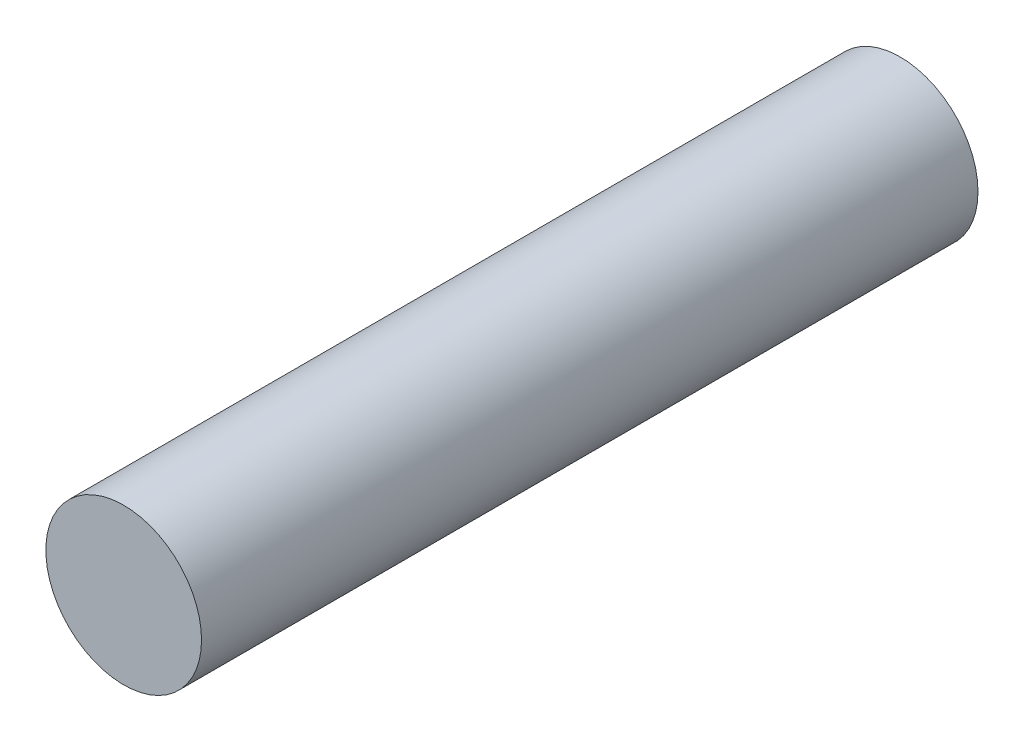
ISO-10303-21;
HEADER;
FILE_DESCRIPTION(('STEP AP214'),'2;1');
FILE_NAME('part.step','',(''),(''),'','','');
FILE_SCHEMA(('AUTOMOTIVE_DESIGN { 1 0 10303 214 1 1 1 1 }'));
ENDSEC;
DATA;
#1=APPLICATION_CONTEXT('core data for automotive mechanical design processes');
#2=APPLICATION_PROTOCOL_DEFINITION('international standard','automotive_design',2000,#1);
#3=PRODUCT_CONTEXT('',#1,'mechanical');
#4=PRODUCT('Part','Part','',(#3));
#5=PRODUCT_RELATED_PRODUCT_CATEGORY('part','',(#4));
#6=PRODUCT_DEFINITION_FORMATION('','',#4);
#7=PRODUCT_DEFINITION_CONTEXT('part definition',#1,'design');
#8=PRODUCT_DEFINITION('design','',#6,#7);
#9=PRODUCT_DEFINITION_SHAPE('','',#8);
#10=(LENGTH_UNIT() NAMED_UNIT(*) SI_UNIT(.MILLI.,.METRE.));
#11=(NAMED_UNIT(*) PLANE_ANGLE_UNIT() SI_UNIT($,.RADIAN.));
#12=(NAMED_UNIT(*) SI_UNIT($,.STERADIAN.) SOLID_ANGLE_UNIT());
#13=UNCERTAINTY_MEASURE_WITH_UNIT(LENGTH_MEASURE(1.E-05),#10,'distance_accuracy_value','');
#14=(GEOMETRIC_REPRESENTATION_CONTEXT(3) GLOBAL_UNCERTAINTY_ASSIGNED_CONTEXT((#13)) GLOBAL_UNIT_ASSIGNED_CONTEXT((#10,
#11,#12)) REPRESENTATION_CONTEXT('',''));
#15=CARTESIAN_POINT('',(0.,0.,0.));
#16=DIRECTION('',(0.,0.,1.));
#17=DIRECTION('',(1.,0.,0.));
#18=AXIS2_PLACEMENT_3D('',#15,#16,#17);
#19=CARTESIAN_POINT('',(0.,0.,26.59));
#20=DIRECTION('',(0.,0.,-1.));
#21=DIRECTION('',(-1.,0.,0.));
#22=AXIS2_PLACEMENT_3D('',#19,#20,#21);
#23=CYLINDRICAL_SURFACE('',#22,3.175);
#24=CARTESIAN_POINT('',(0.,0.,0.));
#25=DIRECTION('',(0.,0.,1.));
#26=DIRECTION('',(1.,0.,0.));
#27=AXIS2_PLACEMENT_3D('',#24,#25,#26);
#28=CIRCLE('',#27,3.175);
#29=CARTESIAN_POINT('',(3.175,0.,0.));
#30=VERTEX_POINT('',#29);
#31=EDGE_CURVE('E10',#30,#30,#28,.T.);
#32=ORIENTED_EDGE('',*,*,#31,.T.);
#33=EDGE_LOOP('',(#32));
#34=FACE_BOUND('',#33,.T.);
#35=CARTESIAN_POINT('',(0.,0.,31.67));
#36=DIRECTION('',(0.,0.,1.));
#37=DIRECTION('',(1.,0.,0.));
#38=AXIS2_PLACEMENT_3D('',#35,#36,#37);
#39=CIRCLE('',#38,3.175);
#40=CARTESIAN_POINT('',(3.175,0.,31.67));
#41=VERTEX_POINT('',#40);
#42=EDGE_CURVE('E37',#41,#41,#39,.T.);
#43=ORIENTED_EDGE('',*,*,#42,.F.);
#44=EDGE_LOOP('',(#43));
#45=FACE_BOUND('',#44,.T.);
#46=ADVANCED_FACE('F31',(#34,#45),#23,.T.);
#47=CARTESIAN_POINT('',(0.,0.,0.));
#48=DIRECTION('',(0.,0.,1.));
#49=DIRECTION('',(1.,0.,0.));
#50=AXIS2_PLACEMENT_3D('',#47,#48,#49);
#51=PLANE('',#50);
#52=ORIENTED_EDGE('',*,*,#31,.F.);
#53=EDGE_LOOP('',(#52));
#54=FACE_BOUND('',#53,.T.);
#55=ADVANCED_FACE('F46',(#54),#51,.F.);
#56=CARTESIAN_POINT('',(0.,0.,31.67));
#57=DIRECTION('',(0.,0.,1.));
#58=DIRECTION('',(1.,0.,0.));
#59=AXIS2_PLACEMENT_3D('',#56,#57,#58);
#60=PLANE('',#59);
#61=ORIENTED_EDGE('',*,*,#42,.T.);
#62=EDGE_LOOP('',(#61));
#63=FACE_BOUND('',#62,.T.);
#64=ADVANCED_FACE('F43',(#63),#60,.T.);
#65=CLOSED_SHELL('',(#46,#55,#64));
#66=MANIFOLD_SOLID_BREP('B2',#65);
#67=ADVANCED_BREP_SHAPE_REPRESENTATION('',(#18,#66),#14);
#68=SHAPE_DEFINITION_REPRESENTATION(#9,#67);
ENDSEC;
END-ISO-10303-21;
